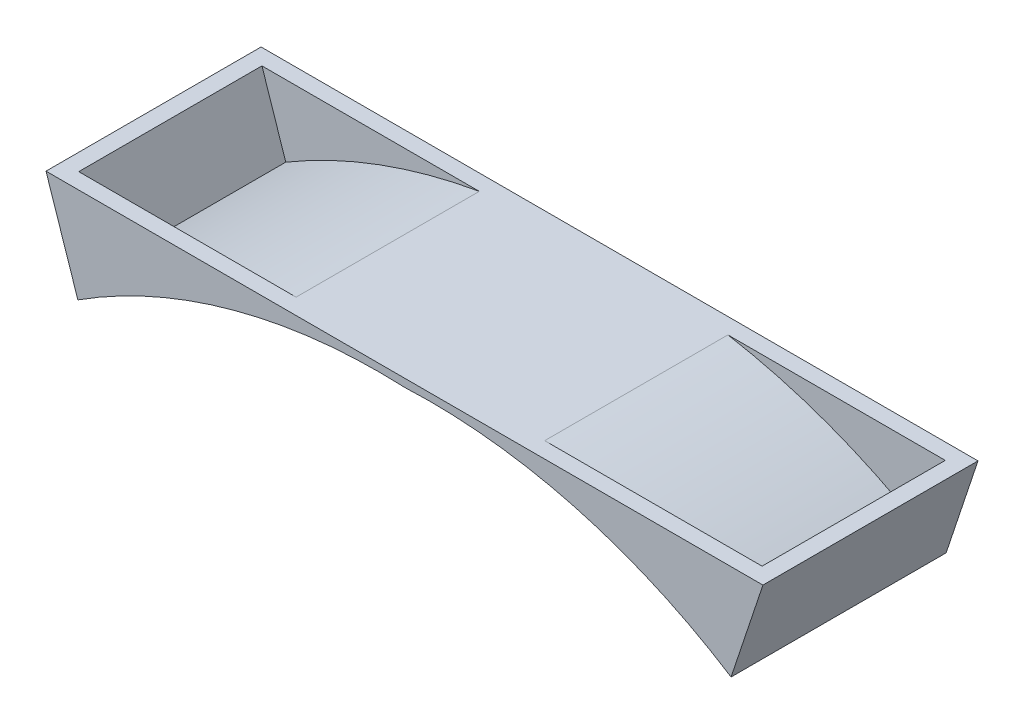
ISO-10303-21;
HEADER;
FILE_DESCRIPTION(('STEP AP214'),'2;1');
FILE_NAME('part.step','',(''),(''),'','','');
FILE_SCHEMA(('AUTOMOTIVE_DESIGN { 1 0 10303 214 1 1 1 1 }'));
ENDSEC;
DATA;
#1=APPLICATION_CONTEXT('core data for automotive mechanical design processes');
#2=APPLICATION_PROTOCOL_DEFINITION('international standard','automotive_design',2000,#1);
#3=PRODUCT_CONTEXT('',#1,'mechanical');
#4=PRODUCT('Part','Part','',(#3));
#5=PRODUCT_RELATED_PRODUCT_CATEGORY('part','',(#4));
#6=PRODUCT_DEFINITION_FORMATION('','',#4);
#7=PRODUCT_DEFINITION_CONTEXT('part definition',#1,'design');
#8=PRODUCT_DEFINITION('design','',#6,#7);
#9=PRODUCT_DEFINITION_SHAPE('','',#8);
#10=(LENGTH_UNIT() NAMED_UNIT(*) SI_UNIT(.MILLI.,.METRE.));
#11=(NAMED_UNIT(*) PLANE_ANGLE_UNIT() SI_UNIT($,.RADIAN.));
#12=(NAMED_UNIT(*) SI_UNIT($,.STERADIAN.) SOLID_ANGLE_UNIT());
#13=UNCERTAINTY_MEASURE_WITH_UNIT(LENGTH_MEASURE(1.E-05),#10,'distance_accuracy_value','');
#14=(GEOMETRIC_REPRESENTATION_CONTEXT(3) GLOBAL_UNCERTAINTY_ASSIGNED_CONTEXT((#13)) GLOBAL_UNIT_ASSIGNED_CONTEXT((#10,
#11,#12)) REPRESENTATION_CONTEXT('',''));
#15=CARTESIAN_POINT('',(0.,0.,0.));
#16=DIRECTION('',(0.,0.,1.));
#17=DIRECTION('',(1.,0.,0.));
#18=AXIS2_PLACEMENT_3D('',#15,#16,#17);
#19=CARTESIAN_POINT('',(45.,0.,27.));
#20=DIRECTION('',(0.,-1.,0.));
#21=DIRECTION('',(1.,0.,0.));
#22=AXIS2_PLACEMENT_3D('',#19,#20,#21);
#23=PLANE('',#22);
#24=DIRECTION('',(-1.,0.,0.));
#25=VECTOR('',#24,1.);
#26=CARTESIAN_POINT('',(45.,0.,0.));
#27=LINE('',#26,#25);
#28=CARTESIAN_POINT('',(45.,0.,0.));
#29=VERTEX_POINT('',#28);
#30=CARTESIAN_POINT('',(-45.,0.,0.));
#31=VERTEX_POINT('',#30);
#32=EDGE_CURVE('E177',#29,#31,#27,.T.);
#33=ORIENTED_EDGE('',*,*,#32,.T.);
#34=DIRECTION('',(0.,0.,-1.));
#35=VECTOR('',#34,1.);
#36=CARTESIAN_POINT('',(-45.,0.,27.));
#37=LINE('',#36,#35);
#38=CARTESIAN_POINT('',(-45.,0.,27.));
#39=VERTEX_POINT('',#38);
#40=EDGE_CURVE('E185',#39,#31,#37,.T.);
#41=ORIENTED_EDGE('',*,*,#40,.F.);
#42=DIRECTION('',(-1.,0.,0.));
#43=VECTOR('',#42,1.);
#44=CARTESIAN_POINT('',(45.,0.,27.));
#45=LINE('',#44,#43);
#46=CARTESIAN_POINT('',(45.,0.,27.));
#47=VERTEX_POINT('',#46);
#48=EDGE_CURVE('E183',#47,#39,#45,.T.);
#49=ORIENTED_EDGE('',*,*,#48,.F.);
#50=DIRECTION('',(0.,0.,-1.));
#51=VECTOR('',#50,1.);
#52=CARTESIAN_POINT('',(45.,0.,27.));
#53=LINE('',#52,#51);
#54=EDGE_CURVE('E197',#47,#29,#53,.T.);
#55=ORIENTED_EDGE('',*,*,#54,.T.);
#56=EDGE_LOOP('',(#33,#41,#49,#55));
#57=FACE_BOUND('',#56,.T.);
#58=DIRECTION('',(-1.,0.,0.));
#59=VECTOR('',#58,1.);
#60=CARTESIAN_POINT('',(-3.21493976185844,0.,2.));
#61=LINE('',#60,#59);
#62=CARTESIAN_POINT('',(-15.6037883945037,0.,2.));
#63=VERTEX_POINT('',#62);
#64=CARTESIAN_POINT('',(-42.8918148932211,0.,2.));
#65=VERTEX_POINT('',#64);
#66=EDGE_CURVE('E146',#63,#65,#61,.T.);
#67=ORIENTED_EDGE('',*,*,#66,.F.);
#68=DIRECTION('',(0.,0.,-1.));
#69=VECTOR('',#68,1.);
#70=CARTESIAN_POINT('',(-15.6037883945037,0.,27.));
#71=LINE('',#70,#69);
#72=CARTESIAN_POINT('',(-15.6037883945037,0.,25.));
#73=VERTEX_POINT('',#72);
#74=EDGE_CURVE('E131',#63,#73,#71,.F.);
#75=ORIENTED_EDGE('',*,*,#74,.T.);
#76=DIRECTION('',(-1.,0.,0.));
#77=VECTOR('',#76,1.);
#78=CARTESIAN_POINT('',(-3.21493976185844,0.,25.));
#79=LINE('',#78,#77);
#80=CARTESIAN_POINT('',(-42.8918148932211,0.,25.));
#81=VERTEX_POINT('',#80);
#82=EDGE_CURVE('E163',#73,#81,#79,.T.);
#83=ORIENTED_EDGE('',*,*,#82,.T.);
#84=DIRECTION('',(0.,0.,-1.));
#85=VECTOR('',#84,1.);
#86=CARTESIAN_POINT('',(-42.8918148932211,0.,27.));
#87=LINE('',#86,#85);
#88=EDGE_CURVE('E164',#81,#65,#87,.T.);
#89=ORIENTED_EDGE('',*,*,#88,.T.);
#90=EDGE_LOOP('',(#67,#75,#83,#89));
#91=FACE_BOUND('',#90,.T.);
#92=CARTESIAN_POINT('',(42.8918148932211,0.,2.));
#93=VERTEX_POINT('',#92);
#94=CARTESIAN_POINT('',(15.6037883945037,0.,2.));
#95=VERTEX_POINT('',#94);
#96=EDGE_CURVE('E161',#93,#95,#61,.T.);
#97=ORIENTED_EDGE('',*,*,#96,.F.);
#98=DIRECTION('',(0.,0.,-1.));
#99=VECTOR('',#98,1.);
#100=CARTESIAN_POINT('',(42.8918148932211,0.,27.));
#101=LINE('',#100,#99);
#102=CARTESIAN_POINT('',(42.8918148932211,0.,25.));
#103=VERTEX_POINT('',#102);
#104=EDGE_CURVE('E157',#103,#93,#101,.T.);
#105=ORIENTED_EDGE('',*,*,#104,.F.);
#106=CARTESIAN_POINT('',(15.6037883945037,0.,25.));
#107=VERTEX_POINT('',#106);
#108=EDGE_CURVE('E55',#103,#107,#79,.T.);
#109=ORIENTED_EDGE('',*,*,#108,.T.);
#110=DIRECTION('',(0.,0.,-1.));
#111=VECTOR('',#110,1.);
#112=CARTESIAN_POINT('',(15.6037883945037,0.,27.));
#113=LINE('',#112,#111);
#114=EDGE_CURVE('E142',#95,#107,#113,.F.);
#115=ORIENTED_EDGE('',*,*,#114,.F.);
#116=EDGE_LOOP('',(#97,#105,#109,#115));
#117=FACE_BOUND('',#116,.T.);
#118=ADVANCED_FACE('F40',(#57,#91,#117),#23,.F.);
#119=CARTESIAN_POINT('',(-45.,0.,27.));
#120=DIRECTION('',(0.948683298050514,0.316227766016838,0.));
#121=DIRECTION('',(-0.316227766016838,0.948683298050514,0.));
#122=AXIS2_PLACEMENT_3D('',#119,#120,#121);
#123=PLANE('',#122);
#124=DIRECTION('',(0.316227766016838,-0.948683298050514,0.));
#125=VECTOR('',#124,1.);
#126=CARTESIAN_POINT('',(-45.,0.,0.));
#127=LINE('',#126,#125);
#128=CARTESIAN_POINT('',(-41.,-12.,0.));
#129=VERTEX_POINT('',#128);
#130=EDGE_CURVE('E172',#31,#129,#127,.T.);
#131=ORIENTED_EDGE('',*,*,#130,.T.);
#132=DIRECTION('',(0.,0.,-1.));
#133=VECTOR('',#132,1.);
#134=CARTESIAN_POINT('',(-41.,-12.,27.));
#135=LINE('',#134,#133);
#136=CARTESIAN_POINT('',(-41.,-12.,27.));
#137=VERTEX_POINT('',#136);
#138=EDGE_CURVE('E11',#137,#129,#135,.T.);
#139=ORIENTED_EDGE('',*,*,#138,.F.);
#140=DIRECTION('',(0.316227766016838,-0.948683298050514,0.));
#141=VECTOR('',#140,1.);
#142=CARTESIAN_POINT('',(-45.,0.,27.));
#143=LINE('',#142,#141);
#144=EDGE_CURVE('E173',#39,#137,#143,.T.);
#145=ORIENTED_EDGE('',*,*,#144,.F.);
#146=ORIENTED_EDGE('',*,*,#40,.T.);
#147=EDGE_LOOP('',(#131,#139,#145,#146));
#148=FACE_BOUND('',#147,.T.);
#149=ADVANCED_FACE('F42',(#148),#123,.F.);
#150=CARTESIAN_POINT('',(-3.21493976185843,-70.9261336148912,27.));
#151=DIRECTION('',(0.,0.,-1.));
#152=DIRECTION('',(-1.,0.,0.));
#153=AXIS2_PLACEMENT_3D('',#150,#151,#152);
#154=CYLINDRICAL_SURFACE('',#153,70.);
#155=CARTESIAN_POINT('',(-3.21493976185843,-70.9261336148912,0.));
#156=DIRECTION('',(0.,0.,-1.));
#157=DIRECTION('',(-1.,0.,0.));
#158=AXIS2_PLACEMENT_3D('',#155,#156,#157);
#159=CIRCLE('',#158,70.);
#160=CARTESIAN_POINT('',(0.,-1.,0.));
#161=VERTEX_POINT('',#160);
#162=EDGE_CURVE('E188',#129,#161,#159,.T.);
#163=ORIENTED_EDGE('',*,*,#162,.T.);
#164=DIRECTION('',(0.,0.,-1.));
#165=VECTOR('',#164,1.);
#166=CARTESIAN_POINT('',(0.,-1.,27.));
#167=LINE('',#166,#165);
#168=CARTESIAN_POINT('',(0.,-1.,27.));
#169=VERTEX_POINT('',#168);
#170=EDGE_CURVE('E48',#169,#161,#167,.T.);
#171=ORIENTED_EDGE('',*,*,#170,.F.);
#172=CARTESIAN_POINT('',(-3.21493976185843,-70.9261336148912,27.));
#173=DIRECTION('',(0.,0.,-1.));
#174=DIRECTION('',(-1.,0.,0.));
#175=AXIS2_PLACEMENT_3D('',#172,#173,#174);
#176=CIRCLE('',#175,70.);
#177=EDGE_CURVE('E176',#137,#169,#176,.T.);
#178=ORIENTED_EDGE('',*,*,#177,.F.);
#179=ORIENTED_EDGE('',*,*,#138,.T.);
#180=EDGE_LOOP('',(#163,#171,#178,#179));
#181=FACE_BOUND('',#180,.T.);
#182=ADVANCED_FACE('F227',(#181),#154,.F.);
#183=CARTESIAN_POINT('',(3.21493976185843,-70.9261336148912,27.));
#184=DIRECTION('',(0.,0.,-1.));
#185=DIRECTION('',(-1.,0.,0.));
#186=AXIS2_PLACEMENT_3D('',#183,#184,#185);
#187=CYLINDRICAL_SURFACE('',#186,70.);
#188=CARTESIAN_POINT('',(3.21493976185843,-70.9261336148912,0.));
#189=DIRECTION('',(0.,0.,-1.));
#190=DIRECTION('',(1.,0.,0.));
#191=AXIS2_PLACEMENT_3D('',#188,#189,#190);
#192=CIRCLE('',#191,70.);
#193=CARTESIAN_POINT('',(41.,-12.,0.));
#194=VERTEX_POINT('',#193);
#195=EDGE_CURVE('E190',#161,#194,#192,.T.);
#196=ORIENTED_EDGE('',*,*,#195,.T.);
#197=DIRECTION('',(0.,0.,-1.));
#198=VECTOR('',#197,1.);
#199=CARTESIAN_POINT('',(41.,-12.,27.));
#200=LINE('',#199,#198);
#201=CARTESIAN_POINT('',(41.,-12.,27.));
#202=VERTEX_POINT('',#201);
#203=EDGE_CURVE('E200',#202,#194,#200,.T.);
#204=ORIENTED_EDGE('',*,*,#203,.F.);
#205=CARTESIAN_POINT('',(3.21493976185843,-70.9261336148912,27.));
#206=DIRECTION('',(0.,0.,-1.));
#207=DIRECTION('',(1.,0.,0.));
#208=AXIS2_PLACEMENT_3D('',#205,#206,#207);
#209=CIRCLE('',#208,70.);
#210=EDGE_CURVE('E179',#169,#202,#209,.T.);
#211=ORIENTED_EDGE('',*,*,#210,.F.);
#212=ORIENTED_EDGE('',*,*,#170,.T.);
#213=EDGE_LOOP('',(#196,#204,#211,#212));
#214=FACE_BOUND('',#213,.T.);
#215=ADVANCED_FACE('F207',(#214),#187,.F.);
#216=CARTESIAN_POINT('',(45.,0.,27.));
#217=DIRECTION('',(-0.948683298050513,0.316227766016839,0.));
#218=DIRECTION('',(-0.316227766016839,-0.948683298050514,0.));
#219=AXIS2_PLACEMENT_3D('',#216,#217,#218);
#220=PLANE('',#219);
#221=DIRECTION('',(0.316227766016839,0.948683298050513,0.));
#222=VECTOR('',#221,1.);
#223=CARTESIAN_POINT('',(45.,0.,0.));
#224=LINE('',#223,#222);
#225=EDGE_CURVE('E192',#194,#29,#224,.T.);
#226=ORIENTED_EDGE('',*,*,#225,.T.);
#227=ORIENTED_EDGE('',*,*,#54,.F.);
#228=DIRECTION('',(0.316227766016839,0.948683298050513,0.));
#229=VECTOR('',#228,1.);
#230=CARTESIAN_POINT('',(45.,0.,27.));
#231=LINE('',#230,#229);
#232=EDGE_CURVE('E181',#202,#47,#231,.T.);
#233=ORIENTED_EDGE('',*,*,#232,.F.);
#234=ORIENTED_EDGE('',*,*,#203,.T.);
#235=EDGE_LOOP('',(#226,#227,#233,#234));
#236=FACE_BOUND('',#235,.T.);
#237=ADVANCED_FACE('F217',(#236),#220,.F.);
#238=CARTESIAN_POINT('',(-3.21493976185843,-70.9261336148912,27.));
#239=DIRECTION('',(0.,0.,-1.));
#240=DIRECTION('',(-1.,0.,0.));
#241=AXIS2_PLACEMENT_3D('',#238,#239,#240);
#242=PLANE('',#241);
#243=ORIENTED_EDGE('',*,*,#144,.T.);
#244=ORIENTED_EDGE('',*,*,#177,.T.);
#245=ORIENTED_EDGE('',*,*,#210,.T.);
#246=ORIENTED_EDGE('',*,*,#232,.T.);
#247=ORIENTED_EDGE('',*,*,#48,.T.);
#248=EDGE_LOOP('',(#243,#244,#245,#246,#247));
#249=FACE_BOUND('',#248,.T.);
#250=ADVANCED_FACE('F225',(#249),#242,.F.);
#251=CARTESIAN_POINT('',(-3.21493976185843,-70.9261336148912,0.));
#252=DIRECTION('',(0.,0.,-1.));
#253=DIRECTION('',(-1.,0.,0.));
#254=AXIS2_PLACEMENT_3D('',#251,#252,#253);
#255=PLANE('',#254);
#256=ORIENTED_EDGE('',*,*,#130,.F.);
#257=ORIENTED_EDGE('',*,*,#32,.F.);
#258=ORIENTED_EDGE('',*,*,#225,.F.);
#259=ORIENTED_EDGE('',*,*,#195,.F.);
#260=ORIENTED_EDGE('',*,*,#162,.F.);
#261=EDGE_LOOP('',(#256,#257,#258,#259,#260));
#262=FACE_BOUND('',#261,.T.);
#263=ADVANCED_FACE('F213',(#262),#255,.T.);
#264=CARTESIAN_POINT('',(-3.21493976185843,-70.9261336148912,2.));
#265=DIRECTION('',(0.,0.,-1.));
#266=DIRECTION('',(-1.,0.,0.));
#267=AXIS2_PLACEMENT_3D('',#264,#265,#266);
#268=PLANE('',#267);
#269=DIRECTION('',(0.316227766016838,-0.948683298050514,0.));
#270=VECTOR('',#269,1.);
#271=CARTESIAN_POINT('',(-17.6462872956174,-75.7365827928109,2.));
#272=LINE('',#271,#270);
#273=CARTESIAN_POINT('',(-39.9007155899289,-8.97329790987642,2.));
#274=VERTEX_POINT('',#273);
#275=EDGE_CURVE('E136',#65,#274,#272,.T.);
#276=ORIENTED_EDGE('',*,*,#275,.T.);
#277=CARTESIAN_POINT('',(-3.21493976185843,-70.9261336148912,2.));
#278=DIRECTION('',(0.,0.,-1.));
#279=DIRECTION('',(-1.,0.,0.));
#280=AXIS2_PLACEMENT_3D('',#277,#278,#279);
#281=CIRCLE('',#280,72.);
#282=EDGE_CURVE('E125',#274,#63,#281,.T.);
#283=ORIENTED_EDGE('',*,*,#282,.T.);
#284=ORIENTED_EDGE('',*,*,#66,.T.);
#285=EDGE_LOOP('',(#276,#283,#284));
#286=FACE_BOUND('',#285,.T.);
#287=ADVANCED_FACE('F145',(#286),#268,.F.);
#288=CARTESIAN_POINT('',(-3.21493976185843,-70.9261336148912,27.));
#289=DIRECTION('',(0.,0.,-1.));
#290=DIRECTION('',(-1.,0.,0.));
#291=AXIS2_PLACEMENT_3D('',#288,#289,#290);
#292=CYLINDRICAL_SURFACE('',#291,72.);
#293=ORIENTED_EDGE('',*,*,#282,.F.);
#294=DIRECTION('',(0.,0.,-1.));
#295=VECTOR('',#294,1.);
#296=CARTESIAN_POINT('',(-39.9007155899289,-8.97329790987642,25.));
#297=LINE('',#296,#295);
#298=CARTESIAN_POINT('',(-39.9007155899289,-8.97329790987642,25.));
#299=VERTEX_POINT('',#298);
#300=EDGE_CURVE('E129',#299,#274,#297,.T.);
#301=ORIENTED_EDGE('',*,*,#300,.F.);
#302=CARTESIAN_POINT('',(-3.21493976185843,-70.9261336148912,25.));
#303=DIRECTION('',(0.,0.,-1.));
#304=DIRECTION('',(-1.,0.,0.));
#305=AXIS2_PLACEMENT_3D('',#302,#303,#304);
#306=CIRCLE('',#305,72.);
#307=EDGE_CURVE('E149',#299,#73,#306,.T.);
#308=ORIENTED_EDGE('',*,*,#307,.T.);
#309=ORIENTED_EDGE('',*,*,#74,.F.);
#310=EDGE_LOOP('',(#293,#301,#308,#309));
#311=FACE_BOUND('',#310,.T.);
#312=ADVANCED_FACE('F127',(#311),#292,.T.);
#313=CARTESIAN_POINT('',(-43.102633403899,0.632455532033663,27.));
#314=DIRECTION('',(0.948683298050514,0.316227766016838,0.));
#315=DIRECTION('',(-0.316227766016838,0.948683298050514,0.));
#316=AXIS2_PLACEMENT_3D('',#313,#314,#315);
#317=PLANE('',#316);
#318=ORIENTED_EDGE('',*,*,#275,.F.);
#319=ORIENTED_EDGE('',*,*,#88,.F.);
#320=DIRECTION('',(0.316227766016838,-0.948683298050514,0.));
#321=VECTOR('',#320,1.);
#322=CARTESIAN_POINT('',(-17.6462872956174,-75.7365827928109,25.));
#323=LINE('',#322,#321);
#324=EDGE_CURVE('E63',#81,#299,#323,.T.);
#325=ORIENTED_EDGE('',*,*,#324,.T.);
#326=ORIENTED_EDGE('',*,*,#300,.T.);
#327=EDGE_LOOP('',(#318,#319,#325,#326));
#328=FACE_BOUND('',#327,.T.);
#329=ADVANCED_FACE('F140',(#328),#317,.T.);
#330=CARTESIAN_POINT('',(-3.21493976185843,-70.9261336148912,25.));
#331=DIRECTION('',(0.,0.,-1.));
#332=DIRECTION('',(-1.,0.,0.));
#333=AXIS2_PLACEMENT_3D('',#330,#331,#332);
#334=PLANE('',#333);
#335=ORIENTED_EDGE('',*,*,#307,.F.);
#336=ORIENTED_EDGE('',*,*,#324,.F.);
#337=ORIENTED_EDGE('',*,*,#82,.F.);
#338=EDGE_LOOP('',(#335,#336,#337));
#339=FACE_BOUND('',#338,.T.);
#340=ADVANCED_FACE('F280',(#339),#334,.T.);
#341=CARTESIAN_POINT('',(3.21493976185843,-70.9261336148912,2.));
#342=DIRECTION('',(0.,0.,-1.));
#343=DIRECTION('',(-1.,0.,0.));
#344=AXIS2_PLACEMENT_3D('',#341,#342,#343);
#345=CIRCLE('',#344,72.);
#346=CARTESIAN_POINT('',(39.9007155899289,-8.97329790987642,2.));
#347=VERTEX_POINT('',#346);
#348=EDGE_CURVE('E135',#95,#347,#345,.T.);
#349=ORIENTED_EDGE('',*,*,#348,.T.);
#350=DIRECTION('',(0.316227766016839,0.948683298050514,0.));
#351=VECTOR('',#350,1.);
#352=CARTESIAN_POINT('',(17.0032993432457,-77.665546649926,2.));
#353=LINE('',#352,#351);
#354=EDGE_CURVE('E154',#347,#93,#353,.T.);
#355=ORIENTED_EDGE('',*,*,#354,.T.);
#356=ORIENTED_EDGE('',*,*,#96,.T.);
#357=EDGE_LOOP('',(#349,#355,#356));
#358=FACE_BOUND('',#357,.T.);
#359=ADVANCED_FACE('F268',(#358),#268,.F.);
#360=CARTESIAN_POINT('',(3.21493976185843,-70.9261336148912,27.));
#361=DIRECTION('',(0.,0.,-1.));
#362=DIRECTION('',(-1.,0.,0.));
#363=AXIS2_PLACEMENT_3D('',#360,#361,#362);
#364=CYLINDRICAL_SURFACE('',#363,72.);
#365=ORIENTED_EDGE('',*,*,#114,.T.);
#366=CARTESIAN_POINT('',(3.21493976185843,-70.9261336148912,25.));
#367=DIRECTION('',(0.,0.,-1.));
#368=DIRECTION('',(-1.,0.,0.));
#369=AXIS2_PLACEMENT_3D('',#366,#367,#368);
#370=CIRCLE('',#369,72.);
#371=CARTESIAN_POINT('',(39.9007155899289,-8.97329790987642,25.));
#372=VERTEX_POINT('',#371);
#373=EDGE_CURVE('E152',#107,#372,#370,.T.);
#374=ORIENTED_EDGE('',*,*,#373,.T.);
#375=DIRECTION('',(0.,0.,-1.));
#376=VECTOR('',#375,1.);
#377=CARTESIAN_POINT('',(39.9007155899289,-8.97329790987642,25.));
#378=LINE('',#377,#376);
#379=EDGE_CURVE('E143',#372,#347,#378,.T.);
#380=ORIENTED_EDGE('',*,*,#379,.T.);
#381=ORIENTED_EDGE('',*,*,#348,.F.);
#382=EDGE_LOOP('',(#365,#374,#380,#381));
#383=FACE_BOUND('',#382,.T.);
#384=ADVANCED_FACE('F294',(#383),#364,.T.);
#385=CARTESIAN_POINT('',(43.102633403899,0.632455532033675,27.));
#386=DIRECTION('',(-0.948683298050513,0.316227766016839,0.));
#387=DIRECTION('',(-0.316227766016839,-0.948683298050514,0.));
#388=AXIS2_PLACEMENT_3D('',#385,#386,#387);
#389=PLANE('',#388);
#390=ORIENTED_EDGE('',*,*,#354,.F.);
#391=ORIENTED_EDGE('',*,*,#379,.F.);
#392=DIRECTION('',(0.316227766016839,0.948683298050514,0.));
#393=VECTOR('',#392,1.);
#394=CARTESIAN_POINT('',(17.0032993432457,-77.665546649926,25.));
#395=LINE('',#394,#393);
#396=EDGE_CURVE('E159',#372,#103,#395,.T.);
#397=ORIENTED_EDGE('',*,*,#396,.T.);
#398=ORIENTED_EDGE('',*,*,#104,.T.);
#399=EDGE_LOOP('',(#390,#391,#397,#398));
#400=FACE_BOUND('',#399,.T.);
#401=ADVANCED_FACE('F301',(#400),#389,.T.);
#402=ORIENTED_EDGE('',*,*,#108,.F.);
#403=ORIENTED_EDGE('',*,*,#396,.F.);
#404=ORIENTED_EDGE('',*,*,#373,.F.);
#405=EDGE_LOOP('',(#402,#403,#404));
#406=FACE_BOUND('',#405,.T.);
#407=ADVANCED_FACE('F288',(#406),#334,.T.);
#408=CLOSED_SHELL('',(#118,#149,#182,#215,#237,#250,#263,#287,#312,#329,#340,#359,#384,#401,#407));
#409=MANIFOLD_SOLID_BREP('B2',#408);
#410=ADVANCED_BREP_SHAPE_REPRESENTATION('',(#18,#409),#14);
#411=SHAPE_DEFINITION_REPRESENTATION(#9,#410);
ENDSEC;
END-ISO-10303-21;
